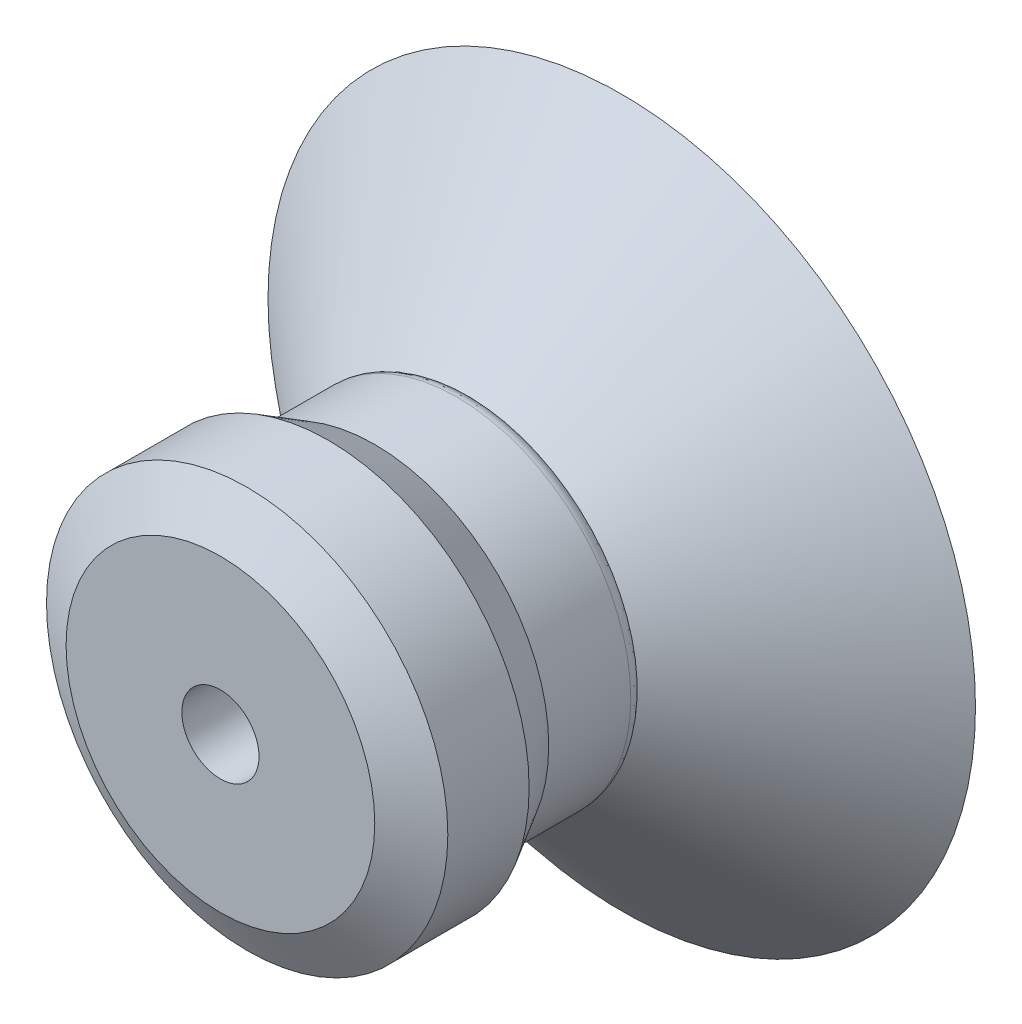
ISO-10303-21;
HEADER;
FILE_DESCRIPTION(('STEP AP214'),'2;1');
FILE_NAME('part.step','',(''),(''),'','','');
FILE_SCHEMA(('AUTOMOTIVE_DESIGN { 1 0 10303 214 1 1 1 1 }'));
ENDSEC;
DATA;
#1=APPLICATION_CONTEXT('core data for automotive mechanical design processes');
#2=APPLICATION_PROTOCOL_DEFINITION('international standard','automotive_design',2000,#1);
#3=PRODUCT_CONTEXT('',#1,'mechanical');
#4=PRODUCT('Part','Part','',(#3));
#5=PRODUCT_RELATED_PRODUCT_CATEGORY('part','',(#4));
#6=PRODUCT_DEFINITION_FORMATION('','',#4);
#7=PRODUCT_DEFINITION_CONTEXT('part definition',#1,'design');
#8=PRODUCT_DEFINITION('design','',#6,#7);
#9=PRODUCT_DEFINITION_SHAPE('','',#8);
#10=(LENGTH_UNIT() NAMED_UNIT(*) SI_UNIT(.MILLI.,.METRE.));
#11=(NAMED_UNIT(*) PLANE_ANGLE_UNIT() SI_UNIT($,.RADIAN.));
#12=(NAMED_UNIT(*) SI_UNIT($,.STERADIAN.) SOLID_ANGLE_UNIT());
#13=UNCERTAINTY_MEASURE_WITH_UNIT(LENGTH_MEASURE(1.E-05),#10,'distance_accuracy_value','');
#14=(GEOMETRIC_REPRESENTATION_CONTEXT(3) GLOBAL_UNCERTAINTY_ASSIGNED_CONTEXT((#13)) GLOBAL_UNIT_ASSIGNED_CONTEXT((#10,
#11,#12)) REPRESENTATION_CONTEXT('',''));
#15=CARTESIAN_POINT('',(0.,0.,0.));
#16=DIRECTION('',(0.,0.,1.));
#17=DIRECTION('',(1.,0.,0.));
#18=AXIS2_PLACEMENT_3D('',#15,#16,#17);
#19=CARTESIAN_POINT('',(0.,0.,-24.2645175991717));
#20=DIRECTION('',(0.,0.,1.));
#21=DIRECTION('',(1.,0.,0.));
#22=AXIS2_PLACEMENT_3D('',#19,#20,#21);
#23=CYLINDRICAL_SURFACE('',#22,32.5);
#24=CARTESIAN_POINT('',(0.,0.,-16.7645175991717));
#25=DIRECTION('',(0.,0.,-1.));
#26=DIRECTION('',(-1.,0.,0.));
#27=AXIS2_PLACEMENT_3D('',#24,#25,#26);
#28=CIRCLE('',#27,32.5);
#29=CARTESIAN_POINT('',(32.5,0.,-16.7645175991717));
#30=VERTEX_POINT('',#29);
#31=EDGE_CURVE('E50',#30,#30,#28,.F.);
#32=ORIENTED_EDGE('',*,*,#31,.T.);
#33=EDGE_LOOP('',(#32));
#34=FACE_BOUND('',#33,.T.);
#35=CARTESIAN_POINT('',(0.,0.,-3.59464461809391));
#36=DIRECTION('',(0.,0.,-1.));
#37=DIRECTION('',(-1.,0.,0.));
#38=AXIS2_PLACEMENT_3D('',#35,#36,#37);
#39=CIRCLE('',#38,32.5);
#40=CARTESIAN_POINT('',(-32.5,0.,-3.59464461809391));
#41=VERTEX_POINT('',#40);
#42=EDGE_CURVE('E64',#41,#41,#39,.T.);
#43=ORIENTED_EDGE('',*,*,#42,.T.);
#44=EDGE_LOOP('',(#43));
#45=FACE_BOUND('',#44,.T.);
#46=ADVANCED_FACE('F39',(#34,#45),#23,.T.);
#47=CARTESIAN_POINT('',(0.,0.,0.735482400828266));
#48=DIRECTION('',(0.,0.,-1.));
#49=DIRECTION('',(-1.,0.,0.));
#50=AXIS2_PLACEMENT_3D('',#47,#48,#49);
#51=PLANE('',#50);
#52=CARTESIAN_POINT('',(0.,0.,0.735482400828266));
#53=DIRECTION('',(0.,0.,1.));
#54=DIRECTION('',(1.,0.,0.));
#55=AXIS2_PLACEMENT_3D('',#52,#53,#54);
#56=CIRCLE('',#55,6.25);
#57=CARTESIAN_POINT('',(6.25,0.,0.735482400828266));
#58=VERTEX_POINT('',#57);
#59=EDGE_CURVE('E73',#58,#58,#56,.T.);
#60=ORIENTED_EDGE('',*,*,#59,.F.);
#61=EDGE_LOOP('',(#60));
#62=FACE_BOUND('',#61,.T.);
#63=CARTESIAN_POINT('',(0.,0.,0.735482400828266));
#64=DIRECTION('',(0.,0.,-1.));
#65=DIRECTION('',(-1.,0.,0.));
#66=AXIS2_PLACEMENT_3D('',#63,#64,#65);
#67=CIRCLE('',#66,25.);
#68=CARTESIAN_POINT('',(-25.,0.,0.735482400828266));
#69=VERTEX_POINT('',#68);
#70=EDGE_CURVE('E67',#69,#69,#67,.F.);
#71=ORIENTED_EDGE('',*,*,#70,.T.);
#72=EDGE_LOOP('',(#71));
#73=FACE_BOUND('',#72,.T.);
#74=ADVANCED_FACE('F83',(#62,#73),#51,.F.);
#75=CARTESIAN_POINT('',(0.,0.,-3.59464461809391));
#76=DIRECTION('',(0.,0.,-1.));
#77=DIRECTION('',(-1.,0.,0.));
#78=AXIS2_PLACEMENT_3D('',#75,#76,#77);
#79=CONICAL_SURFACE('',#78,32.5,1.0471975511966);
#80=ORIENTED_EDGE('',*,*,#70,.F.);
#81=EDGE_LOOP('',(#80));
#82=FACE_BOUND('',#81,.T.);
#83=ORIENTED_EDGE('',*,*,#42,.F.);
#84=EDGE_LOOP('',(#83));
#85=FACE_BOUND('',#84,.T.);
#86=ADVANCED_FACE('F86',(#82,#85),#79,.T.);
#87=CARTESIAN_POINT('',(0.,0.,-24.2645175991717));
#88=DIRECTION('',(0.,0.,1.));
#89=DIRECTION('',(1.,0.,0.));
#90=AXIS2_PLACEMENT_3D('',#87,#88,#89);
#91=CONICAL_SURFACE('',#90,28.1698729810778,0.523598775598297);
#92=CARTESIAN_POINT('',(0.,0.,-24.2645175991717));
#93=DIRECTION('',(0.,0.,-1.));
#94=DIRECTION('',(-1.,0.,0.));
#95=AXIS2_PLACEMENT_3D('',#92,#93,#94);
#96=CIRCLE('',#95,28.1698729810778);
#97=CARTESIAN_POINT('',(28.1698729810778,0.,-24.2645175991717));
#98=VERTEX_POINT('',#97);
#99=EDGE_CURVE('E55',#98,#98,#96,.T.);
#100=CARTESIAN_POINT('',(32.5,0.,-16.7645175991717));
#101=CARTESIAN_POINT('',(32.4548945102196,0.,-16.8426425991717));
#102=CARTESIAN_POINT('',(32.4097890204391,0.,-16.9207675991717));
#103=CARTESIAN_POINT('',(32.3195780408782,0.,-17.0770175991717));
#104=CARTESIAN_POINT('',(32.2744725510978,0.,-17.1551425991717));
#105=CARTESIAN_POINT('',(32.1842615715369,0.,-17.3113925991717));
#106=CARTESIAN_POINT('',(32.1391560817565,0.,-17.3895175991717));
#107=CARTESIAN_POINT('',(32.0489451021956,0.,-17.5457675991717));
#108=CARTESIAN_POINT('',(32.0038396124152,0.,-17.6238925991717));
#109=CARTESIAN_POINT('',(31.9136286328543,0.,-17.7801425991717));
#110=CARTESIAN_POINT('',(31.8685231430739,0.,-17.8582675991717));
#111=CARTESIAN_POINT('',(31.778312163513,0.,-18.0145175991717));
#112=CARTESIAN_POINT('',(31.7332066737325,0.,-18.0926425991717));
#113=CARTESIAN_POINT('',(31.6429956941717,0.,-18.2488925991717));
#114=CARTESIAN_POINT('',(31.5978902043912,0.,-18.3270175991717));
#115=CARTESIAN_POINT('',(31.5076792248303,0.,-18.4832675991717));
#116=CARTESIAN_POINT('',(31.4625737350499,0.,-18.5613925991717));
#117=CARTESIAN_POINT('',(31.372362755489,0.,-18.7176425991717));
#118=CARTESIAN_POINT('',(31.3272572657086,0.,-18.7957675991717));
#119=CARTESIAN_POINT('',(31.2370462861477,0.,-18.9520175991717));
#120=CARTESIAN_POINT('',(31.1919407963673,0.,-19.0301425991717));
#121=CARTESIAN_POINT('',(31.1017298168064,0.,-19.1863925991717));
#122=CARTESIAN_POINT('',(31.0566243270259,0.,-19.2645175991717));
#123=CARTESIAN_POINT('',(30.9664133474651,0.,-19.4207675991717));
#124=CARTESIAN_POINT('',(30.9213078576846,0.,-19.4988925991717));
#125=CARTESIAN_POINT('',(30.8310968781237,0.,-19.6551425991717));
#126=CARTESIAN_POINT('',(30.7859913883433,0.,-19.7332675991717));
#127=CARTESIAN_POINT('',(30.6957804087824,0.,-19.8895175991717));
#128=CARTESIAN_POINT('',(30.650674919002,0.,-19.9676425991717));
#129=CARTESIAN_POINT('',(30.5604639394411,0.,-20.1238925991717));
#130=CARTESIAN_POINT('',(30.5153584496607,0.,-20.2020175991717));
#131=CARTESIAN_POINT('',(30.4251474700998,0.,-20.3582675991717));
#132=CARTESIAN_POINT('',(30.3800419803193,0.,-20.4363925991717));
#133=CARTESIAN_POINT('',(30.2898310007585,0.,-20.5926425991717));
#134=CARTESIAN_POINT('',(30.244725510978,0.,-20.6707675991717));
#135=CARTESIAN_POINT('',(30.1545145314171,0.,-20.8270175991717));
#136=CARTESIAN_POINT('',(30.1094090416367,0.,-20.9051425991717));
#137=CARTESIAN_POINT('',(30.0191980620758,0.,-21.0613925991717));
#138=CARTESIAN_POINT('',(29.9740925722954,0.,-21.1395175991717));
#139=CARTESIAN_POINT('',(29.8838815927345,0.,-21.2957675991717));
#140=CARTESIAN_POINT('',(29.8387761029541,0.,-21.3738925991717));
#141=CARTESIAN_POINT('',(29.7485651233932,0.,-21.5301425991717));
#142=CARTESIAN_POINT('',(29.7034596336127,0.,-21.6082675991717));
#143=CARTESIAN_POINT('',(29.6132486540519,0.,-21.7645175991717));
#144=CARTESIAN_POINT('',(29.5681431642714,0.,-21.8426425991717));
#145=CARTESIAN_POINT('',(29.4779321847105,0.,-21.9988925991717));
#146=CARTESIAN_POINT('',(29.4328266949301,0.,-22.0770175991717));
#147=CARTESIAN_POINT('',(29.3426157153692,0.,-22.2332675991717));
#148=CARTESIAN_POINT('',(29.2975102255888,0.,-22.3113925991717));
#149=CARTESIAN_POINT('',(29.2072992460279,0.,-22.4676425991717));
#150=CARTESIAN_POINT('',(29.1621937562475,0.,-22.5457675991717));
#151=CARTESIAN_POINT('',(29.0719827766866,0.,-22.7020175991717));
#152=CARTESIAN_POINT('',(29.0268772869062,0.,-22.7801425991717));
#153=CARTESIAN_POINT('',(28.9366663073453,0.,-22.9363925991717));
#154=CARTESIAN_POINT('',(28.8915608175648,0.,-23.0145175991717));
#155=CARTESIAN_POINT('',(28.801349838004,0.,-23.1707675991717));
#156=CARTESIAN_POINT('',(28.7562443482235,0.,-23.2488925991717));
#157=CARTESIAN_POINT('',(28.6660333686626,0.,-23.4051425991717));
#158=CARTESIAN_POINT('',(28.6209278788822,0.,-23.4832675991717));
#159=CARTESIAN_POINT('',(28.5307168993213,0.,-23.6395175991717));
#160=CARTESIAN_POINT('',(28.4856114095409,0.,-23.7176425991717));
#161=CARTESIAN_POINT('',(28.39540042998,0.,-23.8738925991717));
#162=CARTESIAN_POINT('',(28.3502949401996,0.,-23.9520175991717));
#163=CARTESIAN_POINT('',(28.2600839606387,0.,-24.1082675991717));
#164=CARTESIAN_POINT('',(28.2149784708582,0.,-24.1863925991717));
#165=CARTESIAN_POINT('',(28.1698729810778,0.,-24.2645175991717));
#166=B_SPLINE_CURVE_WITH_KNOTS('',3,(#100,#101,#102,#103,#104,#105,#106,#107,#108,#109,#110,
#111,#112,#113,#114,#115,#116,#117,#118,#119,#120,#121,#122,#123,#124,#125,#126,#127,#128,#129,
#130,#131,#132,#133,#134,#135,#136,#137,#138,#139,#140,#141,#142,#143,#144,#145,#146,#147,#148,
#149,#150,#151,#152,#153,#154,#155,#156,#157,#158,#159,#160,#161,#162,#163,#164,#165),
.UNSPECIFIED.,.F.,.F.,(4,2,2,2,2,2,2,2,2,2,2,2,2,2,2,2,2,2,2,2,2,2,2,2,2,2,2,2,2,2,2,2,4),(0.,
0.270632938682639,0.541265877365278,0.811898816047914,1.08253175473056,1.35316469341319,
1.62379763209583,1.89443057077847,2.16506350946111,2.43569644814375,2.70632938682639,
2.97696232550903,3.24759526419166,3.5182282028743,3.78886114155694,4.05949408023958,
4.33012701892222,4.60075995760486,4.8713928962875,5.14202583497014,5.41265877365278,
5.68329171233542,5.95392465101806,6.2245575897007,6.49519052838333,6.76582346706597,
7.03645640574861,7.30708934443125,7.57772228311389,7.84835522179653,8.11898816047917,
8.38962109916181,8.66025403784445),.UNSPECIFIED.);
#167=EDGE_CURVE('BSEAM92',#30,#98,#166,.T.);
#168=ORIENTED_EDGE('',*,*,#31,.F.);
#169=ORIENTED_EDGE('',*,*,#99,.F.);
#170=ORIENTED_EDGE('',*,*,#167,.T.);
#171=ORIENTED_EDGE('',*,*,#167,.F.);
#172=EDGE_LOOP('',(#168,#170,#169,#171));
#173=FACE_BOUND('',#172,.T.);
#174=ADVANCED_FACE('F92',(#173),#91,.T.);
#175=CARTESIAN_POINT('',(0.,0.,-39.2645175991717));
#176=DIRECTION('',(0.,0.,1.));
#177=DIRECTION('',(1.,0.,0.));
#178=AXIS2_PLACEMENT_3D('',#175,#176,#177);
#179=CYLINDRICAL_SURFACE('',#178,28.1698729810778);
#180=CARTESIAN_POINT('',(0.,0.,-37.5613925025887));
#181=DIRECTION('',(0.,0.,-1.));
#182=DIRECTION('',(-1.,0.,0.));
#183=AXIS2_PLACEMENT_3D('',#180,#181,#182);
#184=CIRCLE('',#183,28.1698729810778);
#185=CARTESIAN_POINT('',(-28.1698729810778,0.,-37.5613925025887));
#186=VERTEX_POINT('',#185);
#187=EDGE_CURVE('E10',#186,#186,#184,.F.);
#188=ORIENTED_EDGE('',*,*,#187,.T.);
#189=EDGE_LOOP('',(#188));
#190=FACE_BOUND('',#189,.T.);
#191=ORIENTED_EDGE('',*,*,#99,.T.);
#192=EDGE_LOOP('',(#191));
#193=FACE_BOUND('',#192,.T.);
#194=ADVANCED_FACE('F103',(#190,#193),#179,.T.);
#195=CARTESIAN_POINT('',(0.,0.,-39.2645175991717));
#196=DIRECTION('',(0.,0.,-1.));
#197=DIRECTION('',(-1.,0.,0.));
#198=AXIS2_PLACEMENT_3D('',#195,#196,#197);
#199=CONICAL_SURFACE('',#198,27.5,0.872664625997167);
#200=CARTESIAN_POINT('',(0.,0.,-64.2645175991717));
#201=DIRECTION('',(0.,0.,-1.));
#202=DIRECTION('',(-1.,0.,0.));
#203=AXIS2_PLACEMENT_3D('',#200,#201,#202);
#204=CIRCLE('',#203,57.2938398148553);
#205=CARTESIAN_POINT('',(-57.2938398148553,0.,-64.2645175991717));
#206=VERTEX_POINT('',#205);
#207=EDGE_CURVE('E61',#206,#206,#204,.T.);
#208=ORIENTED_EDGE('',*,*,#207,.F.);
#209=EDGE_LOOP('',(#208));
#210=FACE_BOUND('',#209,.T.);
#211=CARTESIAN_POINT('',(0.,0.,-39.2645175991717));
#212=DIRECTION('',(0.,0.,-1.));
#213=DIRECTION('',(-1.,0.,0.));
#214=AXIS2_PLACEMENT_3D('',#211,#212,#213);
#215=CIRCLE('',#214,27.5);
#216=CARTESIAN_POINT('',(-27.5,0.,-39.2645175991717));
#217=VERTEX_POINT('',#216);
#218=EDGE_CURVE('E46',#217,#217,#215,.T.);
#219=ORIENTED_EDGE('',*,*,#218,.T.);
#220=EDGE_LOOP('',(#219));
#221=FACE_BOUND('',#220,.T.);
#222=ADVANCED_FACE('F108',(#210,#221),#199,.T.);
#223=CARTESIAN_POINT('',(0.,0.,-64.2645175991717));
#224=DIRECTION('',(0.,0.,-1.));
#225=DIRECTION('',(-1.,0.,0.));
#226=AXIS2_PLACEMENT_3D('',#223,#224,#225);
#227=PLANE('',#226);
#228=CARTESIAN_POINT('',(0.,0.,-64.2645175991717));
#229=DIRECTION('',(0.,0.,1.));
#230=DIRECTION('',(0.,-1.,0.));
#231=AXIS2_PLACEMENT_3D('',#228,#229,#230);
#232=CIRCLE('',#231,54.6104546136058);
#233=CARTESIAN_POINT('',(0.,54.6104546136058,-64.2645175991717));
#234=VERTEX_POINT('',#233);
#235=EDGE_CURVE('E59',#234,#234,#232,.T.);
#236=ORIENTED_EDGE('',*,*,#235,.T.);
#237=EDGE_LOOP('',(#236));
#238=FACE_BOUND('',#237,.T.);
#239=ORIENTED_EDGE('',*,*,#207,.T.);
#240=EDGE_LOOP('',(#239));
#241=FACE_BOUND('',#240,.T.);
#242=ADVANCED_FACE('F116',(#238,#241),#227,.T.);
#243=CARTESIAN_POINT('',(0.,0.,-39.2645175991717));
#244=DIRECTION('',(0.,0.,-1.));
#245=DIRECTION('',(0.,1.,0.));
#246=AXIS2_PLACEMENT_3D('',#243,#244,#245);
#247=CONICAL_SURFACE('',#246,0.,1.14148496706285);
#248=CARTESIAN_POINT('',(0.,0.,-42.1256913635277));
#249=DIRECTION('',(0.,0.,-1.));
#250=DIRECTION('',(0.,1.,0.));
#251=AXIS2_PLACEMENT_3D('',#248,#249,#250);
#252=CIRCLE('',#251,6.25);
#253=CARTESIAN_POINT('',(0.,6.24999999999998,-42.1256913635277));
#254=VERTEX_POINT('',#253);
#255=EDGE_CURVE('E71',#254,#254,#252,.F.);
#256=CARTESIAN_POINT('',(0.,6.24999999999998,-42.1256913635277));
#257=CARTESIAN_POINT('',(0.,6.75375473555837,-42.3563041368156));
#258=CARTESIAN_POINT('',(0.,7.25750947111676,-42.5869169101036));
#259=CARTESIAN_POINT('',(0.,8.26501894223355,-43.0481424566795));
#260=CARTESIAN_POINT('',(0.,8.76877367779194,-43.2787552299675));
#261=CARTESIAN_POINT('',(0.,9.77628314890873,-43.7399807765434));
#262=CARTESIAN_POINT('',(0.,10.2800378844671,-43.9705935498313));
#263=CARTESIAN_POINT('',(0.,11.2875473555839,-44.4318190964073));
#264=CARTESIAN_POINT('',(0.,11.7913020911423,-44.6624318696952));
#265=CARTESIAN_POINT('',(0.,12.7988115622591,-45.1236574162711));
#266=CARTESIAN_POINT('',(0.,13.3025662978175,-45.3542701895591));
#267=CARTESIAN_POINT('',(0.,14.3100757689343,-45.815495736135));
#268=CARTESIAN_POINT('',(0.,14.8138305044927,-46.046108509423));
#269=CARTESIAN_POINT('',(0.,15.8213399756095,-46.5073340559989));
#270=CARTESIAN_POINT('',(0.,16.3250947111678,-46.7379468292869));
#271=CARTESIAN_POINT('',(0.,17.3326041822846,-47.1991723758628));
#272=CARTESIAN_POINT('',(0.,17.836358917843,-47.4297851491507));
#273=CARTESIAN_POINT('',(0.,18.8438683889598,-47.8910106957266));
#274=CARTESIAN_POINT('',(0.,19.3476231245182,-48.1216234690146));
#275=CARTESIAN_POINT('',(0.,20.355132595635,-48.5828490155905));
#276=CARTESIAN_POINT('',(0.,20.8588873311934,-48.8134617888785));
#277=CARTESIAN_POINT('',(0.,21.8663968023102,-49.2746873354544));
#278=CARTESIAN_POINT('',(0.,22.3701515378686,-49.5053001087424));
#279=CARTESIAN_POINT('',(0.,23.3776610089854,-49.9665256553183));
#280=CARTESIAN_POINT('',(0.,23.8814157445438,-50.1971384286062));
#281=CARTESIAN_POINT('',(0.,24.8889252156605,-50.6583639751821));
#282=CARTESIAN_POINT('',(0.,25.3926799512189,-50.8889767484701));
#283=CARTESIAN_POINT('',(0.,26.4001894223357,-51.350202295046));
#284=CARTESIAN_POINT('',(0.,26.9039441578941,-51.580815068334));
#285=CARTESIAN_POINT('',(0.,27.9114536290109,-52.0420406149099));
#286=CARTESIAN_POINT('',(0.,28.4152083645693,-52.2726533881979));
#287=CARTESIAN_POINT('',(0.,29.4227178356861,-52.7338789347738));
#288=CARTESIAN_POINT('',(0.,29.9264725712445,-52.9644917080617));
#289=CARTESIAN_POINT('',(0.,30.9339820423613,-53.4257172546377));
#290=CARTESIAN_POINT('',(0.,31.4377367779197,-53.6563300279256));
#291=CARTESIAN_POINT('',(0.,32.4452462490365,-54.1175555745015));
#292=CARTESIAN_POINT('',(0.,32.9490009845948,-54.3481683477895));
#293=CARTESIAN_POINT('',(0.,33.9565104557116,-54.8093938943654));
#294=CARTESIAN_POINT('',(0.,34.46026519127,-55.0400066676534));
#295=CARTESIAN_POINT('',(0.,35.4677746623868,-55.5012322142293));
#296=CARTESIAN_POINT('',(0.,35.9715293979452,-55.7318449875172));
#297=CARTESIAN_POINT('',(0.,36.979038869062,-56.1930705340932));
#298=CARTESIAN_POINT('',(0.,37.4827936046204,-56.4236833073811));
#299=CARTESIAN_POINT('',(0.,38.4903030757372,-56.8849088539571));
#300=CARTESIAN_POINT('',(0.,38.9940578112956,-57.115521627245));
#301=CARTESIAN_POINT('',(0.,40.0015672824124,-57.5767471738209));
#302=CARTESIAN_POINT('',(0.,40.5053220179708,-57.8073599471089));
#303=CARTESIAN_POINT('',(0.,41.5128314890875,-58.2685854936848));
#304=CARTESIAN_POINT('',(0.,42.0165862246459,-58.4991982669728));
#305=CARTESIAN_POINT('',(0.,43.0240956957627,-58.9604238135487));
#306=CARTESIAN_POINT('',(0.,43.5278504313211,-59.1910365868366));
#307=CARTESIAN_POINT('',(0.,44.5353599024379,-59.6522621334125));
#308=CARTESIAN_POINT('',(0.,45.0391146379963,-59.8828749067005));
#309=CARTESIAN_POINT('',(0.,46.0466241091131,-60.3441004532764));
#310=CARTESIAN_POINT('',(0.,46.5503788446715,-60.5747132265644));
#311=CARTESIAN_POINT('',(0.,47.5578883157883,-61.0359387731403));
#312=CARTESIAN_POINT('',(0.,48.0616430513467,-61.2665515464283));
#313=CARTESIAN_POINT('',(0.,49.0691525224634,-61.7277770930042));
#314=CARTESIAN_POINT('',(0.,49.5729072580218,-61.9583898662921));
#315=CARTESIAN_POINT('',(0.,50.5804167291386,-62.4196154128681));
#316=CARTESIAN_POINT('',(0.,51.084171464697,-62.650228186156));
#317=CARTESIAN_POINT('',(0.,52.0916809358138,-63.1114537327319));
#318=CARTESIAN_POINT('',(0.,52.5954356713722,-63.3420665060199));
#319=CARTESIAN_POINT('',(0.,53.602945142489,-63.8032920525958));
#320=CARTESIAN_POINT('',(0.,54.1066998780474,-64.0339048258838));
#321=CARTESIAN_POINT('',(0.,54.6104546136058,-64.2645175991717));
#322=B_SPLINE_CURVE_WITH_KNOTS('',3,(#256,#257,#258,#259,#260,#261,#262,#263,#264,#265,#266,
#267,#268,#269,#270,#271,#272,#273,#274,#275,#276,#277,#278,#279,#280,#281,#282,#283,#284,#285,
#286,#287,#288,#289,#290,#291,#292,#293,#294,#295,#296,#297,#298,#299,#300,#301,#302,#303,#304,
#305,#306,#307,#308,#309,#310,#311,#312,#313,#314,#315,#316,#317,#318,#319,#320,#321),
.UNSPECIFIED.,.F.,.F.,(4,2,2,2,2,2,2,2,2,2,2,2,2,2,2,2,2,2,2,2,2,2,2,2,2,2,2,2,2,2,2,2,4),(0.,
1.66209499223409,3.32418998446818,4.98628497670227,6.64837996893636,8.31047496117044,
9.97256995340454,11.6346649456386,13.2967599378727,14.9588549301068,16.6209499223409,
18.283044914575,19.9451399068091,21.6072348990432,23.2693298912773,24.9314248835113,
26.5935198757454,28.2556148679795,29.9177098602136,31.5798048524477,33.2418998446818,
34.9039948369159,36.56608982915,38.2281848213841,39.8902798136181,41.5523748058522,
43.2144697980863,44.8765647903204,46.5386597825545,48.2007547747886,49.8628497670227,
51.5249447592568,53.1870397514909),.UNSPECIFIED.);
#323=EDGE_CURVE('BSEAM122',#254,#234,#322,.T.);
#324=ORIENTED_EDGE('',*,*,#255,.T.);
#325=ORIENTED_EDGE('',*,*,#235,.F.);
#326=ORIENTED_EDGE('',*,*,#323,.T.);
#327=ORIENTED_EDGE('',*,*,#323,.F.);
#328=EDGE_LOOP('',(#324,#326,#325,#327));
#329=FACE_BOUND('',#328,.T.);
#330=ADVANCED_FACE('F122',(#329),#247,.F.);
#331=CARTESIAN_POINT('',(0.,0.,-264.264517599172));
#332=DIRECTION('',(0.,0.,1.));
#333=DIRECTION('',(1.,0.,0.));
#334=AXIS2_PLACEMENT_3D('',#331,#332,#333);
#335=CYLINDRICAL_SURFACE('',#334,6.25);
#336=ORIENTED_EDGE('',*,*,#59,.T.);
#337=EDGE_LOOP('',(#336));
#338=FACE_BOUND('',#337,.T.);
#339=ORIENTED_EDGE('',*,*,#255,.F.);
#340=EDGE_LOOP('',(#339));
#341=FACE_BOUND('',#340,.T.);
#342=ADVANCED_FACE('F80',(#338,#341),#335,.F.);
#343=CARTESIAN_POINT('',(0.,0.,-37.5613925025887));
#344=DIRECTION('',(0.,0.,-1.));
#345=DIRECTION('',(-1.,0.,0.));
#346=AXIS2_PLACEMENT_3D('',#343,#344,#345);
#347=TOROIDAL_SURFACE('',#346,25.6698729810778,2.5);
#348=ORIENTED_EDGE('',*,*,#187,.F.);
#349=EDGE_LOOP('',(#348));
#350=FACE_BOUND('',#349,.T.);
#351=ORIENTED_EDGE('',*,*,#218,.F.);
#352=EDGE_LOOP('',(#351));
#353=FACE_BOUND('',#352,.T.);
#354=ADVANCED_FACE('F41',(#350,#353),#347,.T.);
#355=CLOSED_SHELL('',(#46,#74,#86,#174,#194,#222,#242,#330,#342,#354));
#356=MANIFOLD_SOLID_BREP('B2',#355);
#357=ADVANCED_BREP_SHAPE_REPRESENTATION('',(#18,#356),#14);
#358=SHAPE_DEFINITION_REPRESENTATION(#9,#357);
ENDSEC;
END-ISO-10303-21;
